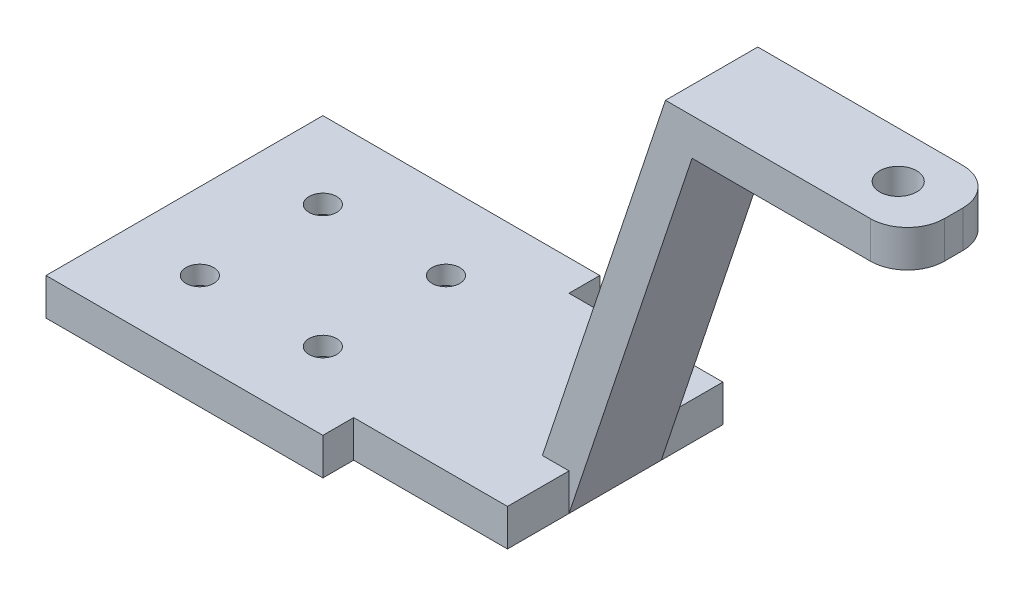
ISO-10303-21;
HEADER;
FILE_DESCRIPTION(('STEP AP214'),'2;1');
FILE_NAME('part.step','',(''),(''),'','','');
FILE_SCHEMA(('AUTOMOTIVE_DESIGN { 1 0 10303 214 1 1 1 1 }'));
ENDSEC;
DATA;
#1=APPLICATION_CONTEXT('core data for automotive mechanical design processes');
#2=APPLICATION_PROTOCOL_DEFINITION('international standard','automotive_design',2000,#1);
#3=PRODUCT_CONTEXT('',#1,'mechanical');
#4=PRODUCT('Part','Part','',(#3));
#5=PRODUCT_RELATED_PRODUCT_CATEGORY('part','',(#4));
#6=PRODUCT_DEFINITION_FORMATION('','',#4);
#7=PRODUCT_DEFINITION_CONTEXT('part definition',#1,'design');
#8=PRODUCT_DEFINITION('design','',#6,#7);
#9=PRODUCT_DEFINITION_SHAPE('','',#8);
#10=(LENGTH_UNIT() NAMED_UNIT(*) SI_UNIT(.MILLI.,.METRE.));
#11=(NAMED_UNIT(*) PLANE_ANGLE_UNIT() SI_UNIT($,.RADIAN.));
#12=(NAMED_UNIT(*) SI_UNIT($,.STERADIAN.) SOLID_ANGLE_UNIT());
#13=UNCERTAINTY_MEASURE_WITH_UNIT(LENGTH_MEASURE(1.E-05),#10,'distance_accuracy_value','');
#14=(GEOMETRIC_REPRESENTATION_CONTEXT(3) GLOBAL_UNCERTAINTY_ASSIGNED_CONTEXT((#13)) GLOBAL_UNIT_ASSIGNED_CONTEXT((#10,
#11,#12)) REPRESENTATION_CONTEXT('',''));
#15=CARTESIAN_POINT('',(0.,0.,0.));
#16=DIRECTION('',(0.,0.,1.));
#17=DIRECTION('',(1.,0.,0.));
#18=AXIS2_PLACEMENT_3D('',#15,#16,#17);
#19=CARTESIAN_POINT('',(0.,0.,0.));
#20=DIRECTION('',(0.,-1.,0.));
#21=DIRECTION('',(0.,0.,-1.));
#22=AXIS2_PLACEMENT_3D('',#19,#20,#21);
#23=PLANE('',#22);
#24=CARTESIAN_POINT('',(-10.,0.,-10.));
#25=DIRECTION('',(0.,-1.,0.));
#26=DIRECTION('',(0.,0.,-1.));
#27=AXIS2_PLACEMENT_3D('',#24,#25,#26);
#28=CIRCLE('',#27,2.25);
#29=CARTESIAN_POINT('',(-10.,0.,-12.25));
#30=VERTEX_POINT('',#29);
#31=EDGE_CURVE('E283',#30,#30,#28,.T.);
#32=ORIENTED_EDGE('',*,*,#31,.T.);
#33=EDGE_LOOP('',(#32));
#34=FACE_BOUND('',#33,.T.);
#35=CARTESIAN_POINT('',(10.,0.,-10.));
#36=DIRECTION('',(0.,-1.,0.));
#37=DIRECTION('',(0.,0.,-1.));
#38=AXIS2_PLACEMENT_3D('',#35,#36,#37);
#39=CIRCLE('',#38,2.25);
#40=CARTESIAN_POINT('',(10.,0.,-12.25));
#41=VERTEX_POINT('',#40);
#42=EDGE_CURVE('E271',#41,#41,#39,.T.);
#43=ORIENTED_EDGE('',*,*,#42,.T.);
#44=EDGE_LOOP('',(#43));
#45=FACE_BOUND('',#44,.T.);
#46=CARTESIAN_POINT('',(10.,0.,10.));
#47=DIRECTION('',(0.,-1.,0.));
#48=DIRECTION('',(0.,0.,-1.));
#49=AXIS2_PLACEMENT_3D('',#46,#47,#48);
#50=CIRCLE('',#49,2.25);
#51=CARTESIAN_POINT('',(10.,0.,7.75));
#52=VERTEX_POINT('',#51);
#53=EDGE_CURVE('E259',#52,#52,#50,.T.);
#54=ORIENTED_EDGE('',*,*,#53,.T.);
#55=EDGE_LOOP('',(#54));
#56=FACE_BOUND('',#55,.T.);
#57=CARTESIAN_POINT('',(-10.,0.,10.));
#58=DIRECTION('',(0.,-1.,0.));
#59=DIRECTION('',(0.,0.,-1.));
#60=AXIS2_PLACEMENT_3D('',#57,#58,#59);
#61=CIRCLE('',#60,2.25);
#62=CARTESIAN_POINT('',(-10.,0.,7.75));
#63=VERTEX_POINT('',#62);
#64=EDGE_CURVE('E247',#63,#63,#61,.T.);
#65=ORIENTED_EDGE('',*,*,#64,.T.);
#66=EDGE_LOOP('',(#65));
#67=FACE_BOUND('',#66,.T.);
#68=DIRECTION('',(1.,0.,0.));
#69=VECTOR('',#68,1.);
#70=CARTESIAN_POINT('',(0.,0.,7.5));
#71=LINE('',#70,#69);
#72=CARTESIAN_POINT('',(43.1754446796632,0.,7.5));
#73=VERTEX_POINT('',#72);
#74=CARTESIAN_POINT('',(47.5,0.,7.5));
#75=VERTEX_POINT('',#74);
#76=EDGE_CURVE('E206',#73,#75,#71,.T.);
#77=ORIENTED_EDGE('',*,*,#76,.F.);
#78=DIRECTION('',(0.,0.,1.));
#79=VECTOR('',#78,1.);
#80=CARTESIAN_POINT('',(43.1754446796632,0.,0.));
#81=LINE('',#80,#79);
#82=CARTESIAN_POINT('',(43.1754446796632,0.,-7.5));
#83=VERTEX_POINT('',#82);
#84=EDGE_CURVE('E324',#83,#73,#81,.T.);
#85=ORIENTED_EDGE('',*,*,#84,.F.);
#86=DIRECTION('',(1.,0.,0.));
#87=VECTOR('',#86,1.);
#88=CARTESIAN_POINT('',(0.,0.,-7.5));
#89=LINE('',#88,#87);
#90=CARTESIAN_POINT('',(47.5,0.,-7.5));
#91=VERTEX_POINT('',#90);
#92=EDGE_CURVE('E203',#83,#91,#89,.T.);
#93=ORIENTED_EDGE('',*,*,#92,.T.);
#94=DIRECTION('',(0.,0.,1.));
#95=VECTOR('',#94,1.);
#96=CARTESIAN_POINT('',(47.5,0.,17.5));
#97=LINE('',#96,#95);
#98=CARTESIAN_POINT('',(47.5,0.,-17.5));
#99=VERTEX_POINT('',#98);
#100=EDGE_CURVE('E220',#99,#91,#97,.T.);
#101=ORIENTED_EDGE('',*,*,#100,.F.);
#102=DIRECTION('',(-1.,0.,0.));
#103=VECTOR('',#102,1.);
#104=CARTESIAN_POINT('',(47.5,0.,-17.5));
#105=LINE('',#104,#103);
#106=CARTESIAN_POINT('',(22.5,0.,-17.5));
#107=VERTEX_POINT('',#106);
#108=EDGE_CURVE('E229',#99,#107,#105,.T.);
#109=ORIENTED_EDGE('',*,*,#108,.T.);
#110=DIRECTION('',(0.,0.,-1.));
#111=VECTOR('',#110,1.);
#112=CARTESIAN_POINT('',(22.5,0.,22.5));
#113=LINE('',#112,#111);
#114=CARTESIAN_POINT('',(22.5,0.,-22.5));
#115=VERTEX_POINT('',#114);
#116=EDGE_CURVE('E286',#107,#115,#113,.T.);
#117=ORIENTED_EDGE('',*,*,#116,.T.);
#118=DIRECTION('',(-1.,0.,0.));
#119=VECTOR('',#118,1.);
#120=CARTESIAN_POINT('',(-22.5,0.,-22.5));
#121=LINE('',#120,#119);
#122=CARTESIAN_POINT('',(-22.5,0.,-22.5));
#123=VERTEX_POINT('',#122);
#124=EDGE_CURVE('E303',#115,#123,#121,.T.);
#125=ORIENTED_EDGE('',*,*,#124,.T.);
#126=DIRECTION('',(0.,0.,1.));
#127=VECTOR('',#126,1.);
#128=CARTESIAN_POINT('',(-22.5,0.,22.5));
#129=LINE('',#128,#127);
#130=CARTESIAN_POINT('',(-22.5,0.,22.5));
#131=VERTEX_POINT('',#130);
#132=EDGE_CURVE('E306',#123,#131,#129,.T.);
#133=ORIENTED_EDGE('',*,*,#132,.T.);
#134=DIRECTION('',(1.,0.,0.));
#135=VECTOR('',#134,1.);
#136=CARTESIAN_POINT('',(-22.5,0.,22.5));
#137=LINE('',#136,#135);
#138=CARTESIAN_POINT('',(22.5,0.,22.5));
#139=VERTEX_POINT('',#138);
#140=EDGE_CURVE('E309',#131,#139,#137,.T.);
#141=ORIENTED_EDGE('',*,*,#140,.T.);
#142=CARTESIAN_POINT('',(22.5,0.,17.5));
#143=VERTEX_POINT('',#142);
#144=EDGE_CURVE('E300',#139,#143,#113,.T.);
#145=ORIENTED_EDGE('',*,*,#144,.T.);
#146=DIRECTION('',(-1.,0.,0.));
#147=VECTOR('',#146,1.);
#148=CARTESIAN_POINT('',(47.5,0.,17.5));
#149=LINE('',#148,#147);
#150=CARTESIAN_POINT('',(47.5,0.,17.5));
#151=VERTEX_POINT('',#150);
#152=EDGE_CURVE('E222',#151,#143,#149,.T.);
#153=ORIENTED_EDGE('',*,*,#152,.F.);
#154=EDGE_CURVE('E219',#75,#151,#97,.T.);
#155=ORIENTED_EDGE('',*,*,#154,.F.);
#156=EDGE_LOOP('',(#77,#85,#93,#101,#109,#117,#125,#133,#141,#145,#153,#155));
#157=FACE_BOUND('',#156,.T.);
#158=ADVANCED_FACE('F35',(#34,#45,#56,#67,#157),#23,.F.);
#159=CARTESIAN_POINT('',(47.5,0.,0.));
#160=DIRECTION('',(1.,0.,0.));
#161=DIRECTION('',(0.,0.,-1.));
#162=AXIS2_PLACEMENT_3D('',#159,#160,#161);
#163=PLANE('',#162);
#164=DIRECTION('',(0.,0.,-1.));
#165=VECTOR('',#164,1.);
#166=CARTESIAN_POINT('',(47.5,-6.,17.5));
#167=LINE('',#166,#165);
#168=CARTESIAN_POINT('',(47.5,-6.,17.5));
#169=VERTEX_POINT('',#168);
#170=CARTESIAN_POINT('',(47.5,-6.,7.5));
#171=VERTEX_POINT('',#170);
#172=EDGE_CURVE('E214',#169,#171,#167,.T.);
#173=ORIENTED_EDGE('',*,*,#172,.T.);
#174=DIRECTION('',(0.,1.,0.));
#175=VECTOR('',#174,1.);
#176=CARTESIAN_POINT('',(47.5,0.,7.5));
#177=LINE('',#176,#175);
#178=EDGE_CURVE('E164',#171,#75,#177,.T.);
#179=ORIENTED_EDGE('',*,*,#178,.T.);
#180=ORIENTED_EDGE('',*,*,#154,.T.);
#181=DIRECTION('',(0.,-1.,0.));
#182=VECTOR('',#181,1.);
#183=CARTESIAN_POINT('',(47.5,0.,17.5));
#184=LINE('',#183,#182);
#185=EDGE_CURVE('E209',#151,#169,#184,.T.);
#186=ORIENTED_EDGE('',*,*,#185,.T.);
#187=EDGE_LOOP('',(#173,#179,#180,#186));
#188=FACE_BOUND('',#187,.T.);
#189=ADVANCED_FACE('F362',(#188),#163,.T.);
#190=CARTESIAN_POINT('',(22.5,-6.,22.5));
#191=DIRECTION('',(1.,0.,0.));
#192=DIRECTION('',(0.,0.,-1.));
#193=AXIS2_PLACEMENT_3D('',#190,#191,#192);
#194=PLANE('',#193);
#195=DIRECTION('',(0.,-1.,0.));
#196=VECTOR('',#195,1.);
#197=CARTESIAN_POINT('',(22.5,0.,17.5));
#198=LINE('',#197,#196);
#199=CARTESIAN_POINT('',(22.5,-6.,17.5));
#200=VERTEX_POINT('',#199);
#201=EDGE_CURVE('E208',#143,#200,#198,.T.);
#202=ORIENTED_EDGE('',*,*,#201,.F.);
#203=ORIENTED_EDGE('',*,*,#144,.F.);
#204=DIRECTION('',(0.,1.,0.));
#205=VECTOR('',#204,1.);
#206=CARTESIAN_POINT('',(22.5,-6.,22.5));
#207=LINE('',#206,#205);
#208=CARTESIAN_POINT('',(22.5,-6.,22.5));
#209=VERTEX_POINT('',#208);
#210=EDGE_CURVE('E312',#209,#139,#207,.T.);
#211=ORIENTED_EDGE('',*,*,#210,.F.);
#212=DIRECTION('',(0.,0.,-1.));
#213=VECTOR('',#212,1.);
#214=CARTESIAN_POINT('',(22.5,-6.,22.5));
#215=LINE('',#214,#213);
#216=EDGE_CURVE('E287',#209,#200,#215,.T.);
#217=ORIENTED_EDGE('',*,*,#216,.T.);
#218=EDGE_LOOP('',(#202,#203,#211,#217));
#219=FACE_BOUND('',#218,.T.);
#220=ADVANCED_FACE('F368',(#219),#194,.T.);
#221=DIRECTION('',(0.,1.,0.));
#222=VECTOR('',#221,1.);
#223=CARTESIAN_POINT('',(22.5,0.,-17.5));
#224=LINE('',#223,#222);
#225=CARTESIAN_POINT('',(22.5,-6.,-17.5));
#226=VERTEX_POINT('',#225);
#227=EDGE_CURVE('E213',#226,#107,#224,.T.);
#228=ORIENTED_EDGE('',*,*,#227,.F.);
#229=CARTESIAN_POINT('',(22.5,-6.,-22.5));
#230=VERTEX_POINT('',#229);
#231=EDGE_CURVE('E290',#226,#230,#215,.T.);
#232=ORIENTED_EDGE('',*,*,#231,.T.);
#233=DIRECTION('',(0.,1.,0.));
#234=VECTOR('',#233,1.);
#235=CARTESIAN_POINT('',(22.5,-6.,-22.5));
#236=LINE('',#235,#234);
#237=EDGE_CURVE('E299',#230,#115,#236,.T.);
#238=ORIENTED_EDGE('',*,*,#237,.T.);
#239=ORIENTED_EDGE('',*,*,#116,.F.);
#240=EDGE_LOOP('',(#228,#232,#238,#239));
#241=FACE_BOUND('',#240,.T.);
#242=ADVANCED_FACE('F381',(#241),#194,.T.);
#243=CARTESIAN_POINT('',(-22.5,-6.,22.5));
#244=DIRECTION('',(0.,0.,1.));
#245=DIRECTION('',(1.,0.,0.));
#246=AXIS2_PLACEMENT_3D('',#243,#244,#245);
#247=PLANE('',#246);
#248=ORIENTED_EDGE('',*,*,#140,.F.);
#249=DIRECTION('',(0.,1.,0.));
#250=VECTOR('',#249,1.);
#251=CARTESIAN_POINT('',(-22.5,-6.,22.5));
#252=LINE('',#251,#250);
#253=CARTESIAN_POINT('',(-22.5,-6.,22.5));
#254=VERTEX_POINT('',#253);
#255=EDGE_CURVE('E315',#254,#131,#252,.T.);
#256=ORIENTED_EDGE('',*,*,#255,.F.);
#257=DIRECTION('',(1.,0.,0.));
#258=VECTOR('',#257,1.);
#259=CARTESIAN_POINT('',(-22.5,-6.,22.5));
#260=LINE('',#259,#258);
#261=EDGE_CURVE('E296',#254,#209,#260,.T.);
#262=ORIENTED_EDGE('',*,*,#261,.T.);
#263=ORIENTED_EDGE('',*,*,#210,.T.);
#264=EDGE_LOOP('',(#248,#256,#262,#263));
#265=FACE_BOUND('',#264,.T.);
#266=ADVANCED_FACE('F377',(#265),#247,.T.);
#267=CARTESIAN_POINT('',(-22.5,-6.,22.5));
#268=DIRECTION('',(-1.,0.,0.));
#269=DIRECTION('',(0.,0.,1.));
#270=AXIS2_PLACEMENT_3D('',#267,#268,#269);
#271=PLANE('',#270);
#272=ORIENTED_EDGE('',*,*,#132,.F.);
#273=DIRECTION('',(0.,1.,0.));
#274=VECTOR('',#273,1.);
#275=CARTESIAN_POINT('',(-22.5,-6.,-22.5));
#276=LINE('',#275,#274);
#277=CARTESIAN_POINT('',(-22.5,-6.,-22.5));
#278=VERTEX_POINT('',#277);
#279=EDGE_CURVE('E317',#278,#123,#276,.T.);
#280=ORIENTED_EDGE('',*,*,#279,.F.);
#281=DIRECTION('',(0.,0.,1.));
#282=VECTOR('',#281,1.);
#283=CARTESIAN_POINT('',(-22.5,-6.,22.5));
#284=LINE('',#283,#282);
#285=EDGE_CURVE('E293',#278,#254,#284,.T.);
#286=ORIENTED_EDGE('',*,*,#285,.T.);
#287=ORIENTED_EDGE('',*,*,#255,.T.);
#288=EDGE_LOOP('',(#272,#280,#286,#287));
#289=FACE_BOUND('',#288,.T.);
#290=ADVANCED_FACE('F380',(#289),#271,.T.);
#291=CARTESIAN_POINT('',(-22.5,-6.,-22.5));
#292=DIRECTION('',(0.,0.,-1.));
#293=DIRECTION('',(-1.,0.,0.));
#294=AXIS2_PLACEMENT_3D('',#291,#292,#293);
#295=PLANE('',#294);
#296=ORIENTED_EDGE('',*,*,#124,.F.);
#297=ORIENTED_EDGE('',*,*,#237,.F.);
#298=DIRECTION('',(-1.,0.,0.));
#299=VECTOR('',#298,1.);
#300=CARTESIAN_POINT('',(-22.5,-6.,-22.5));
#301=LINE('',#300,#299);
#302=EDGE_CURVE('E289',#230,#278,#301,.T.);
#303=ORIENTED_EDGE('',*,*,#302,.T.);
#304=ORIENTED_EDGE('',*,*,#279,.T.);
#305=EDGE_LOOP('',(#296,#297,#303,#304));
#306=FACE_BOUND('',#305,.T.);
#307=ADVANCED_FACE('F385',(#306),#295,.T.);
#308=CARTESIAN_POINT('',(0.,-6.,0.));
#309=DIRECTION('',(0.,-1.,0.));
#310=DIRECTION('',(0.,0.,-1.));
#311=AXIS2_PLACEMENT_3D('',#308,#309,#310);
#312=PLANE('',#311);
#313=DIRECTION('',(0.,0.,-1.));
#314=VECTOR('',#313,1.);
#315=CARTESIAN_POINT('',(47.5,-6.,7.5));
#316=LINE('',#315,#314);
#317=CARTESIAN_POINT('',(47.5,-6.,-7.5));
#318=VERTEX_POINT('',#317);
#319=EDGE_CURVE('E174',#171,#318,#316,.T.);
#320=ORIENTED_EDGE('',*,*,#319,.F.);
#321=ORIENTED_EDGE('',*,*,#172,.F.);
#322=DIRECTION('',(-1.,0.,0.));
#323=VECTOR('',#322,1.);
#324=CARTESIAN_POINT('',(47.5,-6.,17.5));
#325=LINE('',#324,#323);
#326=EDGE_CURVE('E235',#169,#200,#325,.T.);
#327=ORIENTED_EDGE('',*,*,#326,.T.);
#328=ORIENTED_EDGE('',*,*,#216,.F.);
#329=ORIENTED_EDGE('',*,*,#261,.F.);
#330=ORIENTED_EDGE('',*,*,#285,.F.);
#331=ORIENTED_EDGE('',*,*,#302,.F.);
#332=ORIENTED_EDGE('',*,*,#231,.F.);
#333=DIRECTION('',(-1.,0.,0.));
#334=VECTOR('',#333,1.);
#335=CARTESIAN_POINT('',(47.5,-6.,-17.5));
#336=LINE('',#335,#334);
#337=CARTESIAN_POINT('',(47.5,-6.,-17.5));
#338=VERTEX_POINT('',#337);
#339=EDGE_CURVE('E232',#338,#226,#336,.T.);
#340=ORIENTED_EDGE('',*,*,#339,.F.);
#341=EDGE_CURVE('E212',#318,#338,#167,.T.);
#342=ORIENTED_EDGE('',*,*,#341,.F.);
#343=EDGE_LOOP('',(#320,#321,#327,#328,#329,#330,#331,#332,#340,#342));
#344=FACE_BOUND('',#343,.T.);
#345=CARTESIAN_POINT('',(-10.,-6.,10.));
#346=DIRECTION('',(0.,-1.,0.));
#347=DIRECTION('',(0.,0.,-1.));
#348=AXIS2_PLACEMENT_3D('',#345,#346,#347);
#349=CIRCLE('',#348,5.295);
#350=CARTESIAN_POINT('',(-10.,-6.,4.705));
#351=VERTEX_POINT('',#350);
#352=EDGE_CURVE('E238',#351,#351,#349,.T.);
#353=ORIENTED_EDGE('',*,*,#352,.F.);
#354=EDGE_LOOP('',(#353));
#355=FACE_BOUND('',#354,.T.);
#356=CARTESIAN_POINT('',(10.,-6.,10.));
#357=DIRECTION('',(0.,-1.,0.));
#358=DIRECTION('',(0.,0.,-1.));
#359=AXIS2_PLACEMENT_3D('',#356,#357,#358);
#360=CIRCLE('',#359,5.295);
#361=CARTESIAN_POINT('',(10.,-6.,4.705));
#362=VERTEX_POINT('',#361);
#363=EDGE_CURVE('E250',#362,#362,#360,.T.);
#364=ORIENTED_EDGE('',*,*,#363,.F.);
#365=EDGE_LOOP('',(#364));
#366=FACE_BOUND('',#365,.T.);
#367=CARTESIAN_POINT('',(10.,-6.,-10.));
#368=DIRECTION('',(0.,-1.,0.));
#369=DIRECTION('',(0.,0.,-1.));
#370=AXIS2_PLACEMENT_3D('',#367,#368,#369);
#371=CIRCLE('',#370,5.295);
#372=CARTESIAN_POINT('',(10.,-6.,-15.295));
#373=VERTEX_POINT('',#372);
#374=EDGE_CURVE('E262',#373,#373,#371,.T.);
#375=ORIENTED_EDGE('',*,*,#374,.F.);
#376=EDGE_LOOP('',(#375));
#377=FACE_BOUND('',#376,.T.);
#378=CARTESIAN_POINT('',(-10.,-6.,-10.));
#379=DIRECTION('',(0.,-1.,0.));
#380=DIRECTION('',(0.,0.,-1.));
#381=AXIS2_PLACEMENT_3D('',#378,#379,#380);
#382=CIRCLE('',#381,5.295);
#383=CARTESIAN_POINT('',(-10.,-6.,-15.295));
#384=VERTEX_POINT('',#383);
#385=EDGE_CURVE('E274',#384,#384,#382,.T.);
#386=ORIENTED_EDGE('',*,*,#385,.F.);
#387=EDGE_LOOP('',(#386));
#388=FACE_BOUND('',#387,.T.);
#389=ADVANCED_FACE('F375',(#344,#355,#366,#377,#388),#312,.T.);
#390=CARTESIAN_POINT('',(-10.,-6.,-10.));
#391=DIRECTION('',(0.,-1.,0.));
#392=DIRECTION('',(0.,0.,-1.));
#393=AXIS2_PLACEMENT_3D('',#390,#391,#392);
#394=CYLINDRICAL_SURFACE('',#393,2.25);
#395=ORIENTED_EDGE('',*,*,#31,.F.);
#396=EDGE_LOOP('',(#395));
#397=FACE_BOUND('',#396,.T.);
#398=CARTESIAN_POINT('',(-10.,-3.,-10.));
#399=DIRECTION('',(0.,-1.,0.));
#400=DIRECTION('',(0.,0.,-1.));
#401=AXIS2_PLACEMENT_3D('',#398,#399,#400);
#402=CIRCLE('',#401,2.25);
#403=CARTESIAN_POINT('',(-10.,-3.,-12.25));
#404=VERTEX_POINT('',#403);
#405=EDGE_CURVE('E280',#404,#404,#402,.T.);
#406=ORIENTED_EDGE('',*,*,#405,.T.);
#407=EDGE_LOOP('',(#406));
#408=FACE_BOUND('',#407,.T.);
#409=ADVANCED_FACE('F472',(#397,#408),#394,.F.);
#410=CARTESIAN_POINT('',(-7.75,-3.,-10.));
#411=DIRECTION('',(0.,1.,0.));
#412=DIRECTION('',(0.,0.,1.));
#413=AXIS2_PLACEMENT_3D('',#410,#411,#412);
#414=PLANE('',#413);
#415=ORIENTED_EDGE('',*,*,#405,.F.);
#416=EDGE_LOOP('',(#415));
#417=FACE_BOUND('',#416,.T.);
#418=CARTESIAN_POINT('',(-10.,-3.,-10.));
#419=DIRECTION('',(0.,-1.,0.));
#420=DIRECTION('',(0.,0.,-1.));
#421=AXIS2_PLACEMENT_3D('',#418,#419,#420);
#422=CIRCLE('',#421,5.295);
#423=CARTESIAN_POINT('',(-10.,-3.,-15.295));
#424=VERTEX_POINT('',#423);
#425=EDGE_CURVE('E277',#424,#424,#422,.T.);
#426=ORIENTED_EDGE('',*,*,#425,.T.);
#427=EDGE_LOOP('',(#426));
#428=FACE_BOUND('',#427,.T.);
#429=ADVANCED_FACE('F469',(#417,#428),#414,.F.);
#430=CARTESIAN_POINT('',(-10.,-6.,-10.));
#431=DIRECTION('',(0.,-1.,0.));
#432=DIRECTION('',(0.,0.,-1.));
#433=AXIS2_PLACEMENT_3D('',#430,#431,#432);
#434=CYLINDRICAL_SURFACE('',#433,5.295);
#435=ORIENTED_EDGE('',*,*,#425,.F.);
#436=EDGE_LOOP('',(#435));
#437=FACE_BOUND('',#436,.T.);
#438=ORIENTED_EDGE('',*,*,#385,.T.);
#439=EDGE_LOOP('',(#438));
#440=FACE_BOUND('',#439,.T.);
#441=ADVANCED_FACE('F465',(#437,#440),#434,.F.);
#442=CARTESIAN_POINT('',(10.,-6.,-10.));
#443=DIRECTION('',(0.,-1.,0.));
#444=DIRECTION('',(0.,0.,-1.));
#445=AXIS2_PLACEMENT_3D('',#442,#443,#444);
#446=CYLINDRICAL_SURFACE('',#445,2.25);
#447=ORIENTED_EDGE('',*,*,#42,.F.);
#448=EDGE_LOOP('',(#447));
#449=FACE_BOUND('',#448,.T.);
#450=CARTESIAN_POINT('',(10.,-3.,-10.));
#451=DIRECTION('',(0.,-1.,0.));
#452=DIRECTION('',(0.,0.,-1.));
#453=AXIS2_PLACEMENT_3D('',#450,#451,#452);
#454=CIRCLE('',#453,2.25);
#455=CARTESIAN_POINT('',(10.,-3.,-12.25));
#456=VERTEX_POINT('',#455);
#457=EDGE_CURVE('E268',#456,#456,#454,.T.);
#458=ORIENTED_EDGE('',*,*,#457,.T.);
#459=EDGE_LOOP('',(#458));
#460=FACE_BOUND('',#459,.T.);
#461=ADVANCED_FACE('F461',(#449,#460),#446,.F.);
#462=CARTESIAN_POINT('',(12.25,-3.,-10.));
#463=DIRECTION('',(0.,1.,0.));
#464=DIRECTION('',(0.,0.,1.));
#465=AXIS2_PLACEMENT_3D('',#462,#463,#464);
#466=PLANE('',#465);
#467=ORIENTED_EDGE('',*,*,#457,.F.);
#468=EDGE_LOOP('',(#467));
#469=FACE_BOUND('',#468,.T.);
#470=CARTESIAN_POINT('',(10.,-3.,-10.));
#471=DIRECTION('',(0.,-1.,0.));
#472=DIRECTION('',(0.,0.,-1.));
#473=AXIS2_PLACEMENT_3D('',#470,#471,#472);
#474=CIRCLE('',#473,5.295);
#475=CARTESIAN_POINT('',(10.,-3.,-15.295));
#476=VERTEX_POINT('',#475);
#477=EDGE_CURVE('E265',#476,#476,#474,.T.);
#478=ORIENTED_EDGE('',*,*,#477,.T.);
#479=EDGE_LOOP('',(#478));
#480=FACE_BOUND('',#479,.T.);
#481=ADVANCED_FACE('F457',(#469,#480),#466,.F.);
#482=CARTESIAN_POINT('',(10.,-6.,-10.));
#483=DIRECTION('',(0.,-1.,0.));
#484=DIRECTION('',(0.,0.,-1.));
#485=AXIS2_PLACEMENT_3D('',#482,#483,#484);
#486=CYLINDRICAL_SURFACE('',#485,5.295);
#487=ORIENTED_EDGE('',*,*,#477,.F.);
#488=EDGE_LOOP('',(#487));
#489=FACE_BOUND('',#488,.T.);
#490=ORIENTED_EDGE('',*,*,#374,.T.);
#491=EDGE_LOOP('',(#490));
#492=FACE_BOUND('',#491,.T.);
#493=ADVANCED_FACE('F453',(#489,#492),#486,.F.);
#494=CARTESIAN_POINT('',(10.,-6.,10.));
#495=DIRECTION('',(0.,-1.,0.));
#496=DIRECTION('',(0.,0.,-1.));
#497=AXIS2_PLACEMENT_3D('',#494,#495,#496);
#498=CYLINDRICAL_SURFACE('',#497,2.25);
#499=ORIENTED_EDGE('',*,*,#53,.F.);
#500=EDGE_LOOP('',(#499));
#501=FACE_BOUND('',#500,.T.);
#502=CARTESIAN_POINT('',(10.,-3.,10.));
#503=DIRECTION('',(0.,-1.,0.));
#504=DIRECTION('',(0.,0.,-1.));
#505=AXIS2_PLACEMENT_3D('',#502,#503,#504);
#506=CIRCLE('',#505,2.25);
#507=CARTESIAN_POINT('',(10.,-3.,7.75));
#508=VERTEX_POINT('',#507);
#509=EDGE_CURVE('E256',#508,#508,#506,.T.);
#510=ORIENTED_EDGE('',*,*,#509,.T.);
#511=EDGE_LOOP('',(#510));
#512=FACE_BOUND('',#511,.T.);
#513=ADVANCED_FACE('F449',(#501,#512),#498,.F.);
#514=CARTESIAN_POINT('',(12.25,-3.,10.));
#515=DIRECTION('',(0.,1.,0.));
#516=DIRECTION('',(0.,0.,1.));
#517=AXIS2_PLACEMENT_3D('',#514,#515,#516);
#518=PLANE('',#517);
#519=ORIENTED_EDGE('',*,*,#509,.F.);
#520=EDGE_LOOP('',(#519));
#521=FACE_BOUND('',#520,.T.);
#522=CARTESIAN_POINT('',(10.,-3.,10.));
#523=DIRECTION('',(0.,-1.,0.));
#524=DIRECTION('',(0.,0.,-1.));
#525=AXIS2_PLACEMENT_3D('',#522,#523,#524);
#526=CIRCLE('',#525,5.295);
#527=CARTESIAN_POINT('',(10.,-3.,4.705));
#528=VERTEX_POINT('',#527);
#529=EDGE_CURVE('E253',#528,#528,#526,.T.);
#530=ORIENTED_EDGE('',*,*,#529,.T.);
#531=EDGE_LOOP('',(#530));
#532=FACE_BOUND('',#531,.T.);
#533=ADVANCED_FACE('F445',(#521,#532),#518,.F.);
#534=CARTESIAN_POINT('',(10.,-6.,10.));
#535=DIRECTION('',(0.,-1.,0.));
#536=DIRECTION('',(0.,0.,-1.));
#537=AXIS2_PLACEMENT_3D('',#534,#535,#536);
#538=CYLINDRICAL_SURFACE('',#537,5.295);
#539=ORIENTED_EDGE('',*,*,#529,.F.);
#540=EDGE_LOOP('',(#539));
#541=FACE_BOUND('',#540,.T.);
#542=ORIENTED_EDGE('',*,*,#363,.T.);
#543=EDGE_LOOP('',(#542));
#544=FACE_BOUND('',#543,.T.);
#545=ADVANCED_FACE('F441',(#541,#544),#538,.F.);
#546=CARTESIAN_POINT('',(-10.,-6.,10.));
#547=DIRECTION('',(0.,-1.,0.));
#548=DIRECTION('',(0.,0.,-1.));
#549=AXIS2_PLACEMENT_3D('',#546,#547,#548);
#550=CYLINDRICAL_SURFACE('',#549,2.25);
#551=ORIENTED_EDGE('',*,*,#64,.F.);
#552=EDGE_LOOP('',(#551));
#553=FACE_BOUND('',#552,.T.);
#554=CARTESIAN_POINT('',(-10.,-3.,10.));
#555=DIRECTION('',(0.,-1.,0.));
#556=DIRECTION('',(0.,0.,-1.));
#557=AXIS2_PLACEMENT_3D('',#554,#555,#556);
#558=CIRCLE('',#557,2.25);
#559=CARTESIAN_POINT('',(-10.,-3.,7.75));
#560=VERTEX_POINT('',#559);
#561=EDGE_CURVE('E244',#560,#560,#558,.T.);
#562=ORIENTED_EDGE('',*,*,#561,.T.);
#563=EDGE_LOOP('',(#562));
#564=FACE_BOUND('',#563,.T.);
#565=ADVANCED_FACE('F437',(#553,#564),#550,.F.);
#566=CARTESIAN_POINT('',(-7.75,-3.,10.));
#567=DIRECTION('',(0.,1.,0.));
#568=DIRECTION('',(0.,0.,1.));
#569=AXIS2_PLACEMENT_3D('',#566,#567,#568);
#570=PLANE('',#569);
#571=ORIENTED_EDGE('',*,*,#561,.F.);
#572=EDGE_LOOP('',(#571));
#573=FACE_BOUND('',#572,.T.);
#574=CARTESIAN_POINT('',(-10.,-3.,10.));
#575=DIRECTION('',(0.,-1.,0.));
#576=DIRECTION('',(0.,0.,-1.));
#577=AXIS2_PLACEMENT_3D('',#574,#575,#576);
#578=CIRCLE('',#577,5.295);
#579=CARTESIAN_POINT('',(-10.,-3.,4.705));
#580=VERTEX_POINT('',#579);
#581=EDGE_CURVE('E241',#580,#580,#578,.T.);
#582=ORIENTED_EDGE('',*,*,#581,.T.);
#583=EDGE_LOOP('',(#582));
#584=FACE_BOUND('',#583,.T.);
#585=ADVANCED_FACE('F431',(#573,#584),#570,.F.);
#586=CARTESIAN_POINT('',(-10.,-6.,10.));
#587=DIRECTION('',(0.,-1.,0.));
#588=DIRECTION('',(0.,0.,-1.));
#589=AXIS2_PLACEMENT_3D('',#586,#587,#588);
#590=CYLINDRICAL_SURFACE('',#589,5.295);
#591=ORIENTED_EDGE('',*,*,#581,.F.);
#592=EDGE_LOOP('',(#591));
#593=FACE_BOUND('',#592,.T.);
#594=ORIENTED_EDGE('',*,*,#352,.T.);
#595=EDGE_LOOP('',(#594));
#596=FACE_BOUND('',#595,.T.);
#597=ADVANCED_FACE('F424',(#593,#596),#590,.F.);
#598=CARTESIAN_POINT('',(47.5,0.,17.5));
#599=DIRECTION('',(0.,0.,-1.));
#600=DIRECTION('',(-1.,0.,0.));
#601=AXIS2_PLACEMENT_3D('',#598,#599,#600);
#602=PLANE('',#601);
#603=ORIENTED_EDGE('',*,*,#201,.T.);
#604=ORIENTED_EDGE('',*,*,#326,.F.);
#605=ORIENTED_EDGE('',*,*,#185,.F.);
#606=ORIENTED_EDGE('',*,*,#152,.T.);
#607=EDGE_LOOP('',(#603,#604,#605,#606));
#608=FACE_BOUND('',#607,.T.);
#609=ADVANCED_FACE('F415',(#608),#602,.F.);
#610=CARTESIAN_POINT('',(47.5,0.,-17.5));
#611=DIRECTION('',(0.,0.,1.));
#612=DIRECTION('',(1.,0.,0.));
#613=AXIS2_PLACEMENT_3D('',#610,#611,#612);
#614=PLANE('',#613);
#615=ORIENTED_EDGE('',*,*,#227,.T.);
#616=ORIENTED_EDGE('',*,*,#108,.F.);
#617=DIRECTION('',(0.,1.,0.));
#618=VECTOR('',#617,1.);
#619=CARTESIAN_POINT('',(47.5,0.,-17.5));
#620=LINE('',#619,#618);
#621=EDGE_CURVE('E217',#338,#99,#620,.T.);
#622=ORIENTED_EDGE('',*,*,#621,.F.);
#623=ORIENTED_EDGE('',*,*,#339,.T.);
#624=EDGE_LOOP('',(#615,#616,#622,#623));
#625=FACE_BOUND('',#624,.T.);
#626=ADVANCED_FACE('F407',(#625),#614,.F.);
#627=DIRECTION('',(0.,1.,0.));
#628=VECTOR('',#627,1.);
#629=CARTESIAN_POINT('',(47.5,0.,-7.5));
#630=LINE('',#629,#628);
#631=EDGE_CURVE('E314',#318,#91,#630,.T.);
#632=ORIENTED_EDGE('',*,*,#631,.F.);
#633=ORIENTED_EDGE('',*,*,#341,.T.);
#634=ORIENTED_EDGE('',*,*,#621,.T.);
#635=ORIENTED_EDGE('',*,*,#100,.T.);
#636=EDGE_LOOP('',(#632,#633,#634,#635));
#637=FACE_BOUND('',#636,.T.);
#638=ADVANCED_FACE('F371',(#637),#163,.T.);
#639=CARTESIAN_POINT('',(63.1754446796632,60.,7.5));
#640=DIRECTION('',(0.948683298050514,-0.316227766016838,0.));
#641=DIRECTION('',(0.316227766016838,0.948683298050514,0.));
#642=AXIS2_PLACEMENT_3D('',#639,#640,#641);
#643=PLANE('',#642);
#644=DIRECTION('',(-0.316227766016838,-0.948683298050514,0.));
#645=VECTOR('',#644,1.);
#646=CARTESIAN_POINT('',(63.1754446796632,60.,-7.5));
#647=LINE('',#646,#645);
#648=CARTESIAN_POINT('',(63.1754446796632,60.,-7.5));
#649=VERTEX_POINT('',#648);
#650=EDGE_CURVE('E167',#649,#83,#647,.T.);
#651=ORIENTED_EDGE('',*,*,#650,.T.);
#652=ORIENTED_EDGE('',*,*,#84,.T.);
#653=DIRECTION('',(-0.316227766016838,-0.948683298050514,0.));
#654=VECTOR('',#653,1.);
#655=CARTESIAN_POINT('',(63.1754446796632,60.,7.5));
#656=LINE('',#655,#654);
#657=CARTESIAN_POINT('',(63.1754446796632,60.,7.5));
#658=VERTEX_POINT('',#657);
#659=EDGE_CURVE('E180',#658,#73,#656,.T.);
#660=ORIENTED_EDGE('',*,*,#659,.F.);
#661=DIRECTION('',(0.,0.,-1.));
#662=VECTOR('',#661,1.);
#663=CARTESIAN_POINT('',(63.1754446796632,60.,7.5));
#664=LINE('',#663,#662);
#665=EDGE_CURVE('E186',#658,#649,#664,.T.);
#666=ORIENTED_EDGE('',*,*,#665,.T.);
#667=EDGE_LOOP('',(#651,#652,#660,#666));
#668=FACE_BOUND('',#667,.T.);
#669=ADVANCED_FACE('F352',(#668),#643,.F.);
#670=CARTESIAN_POINT('',(0.,0.,7.5));
#671=DIRECTION('',(0.,0.,-1.));
#672=DIRECTION('',(-1.,0.,0.));
#673=AXIS2_PLACEMENT_3D('',#670,#671,#672);
#674=PLANE('',#673);
#675=DIRECTION('',(1.,0.,0.));
#676=VECTOR('',#675,1.);
#677=CARTESIAN_POINT('',(67.5,54.,7.5));
#678=LINE('',#677,#676);
#679=CARTESIAN_POINT('',(67.5,54.,7.5));
#680=VERTEX_POINT('',#679);
#681=CARTESIAN_POINT('',(96.5,54.,7.5));
#682=VERTEX_POINT('',#681);
#683=EDGE_CURVE('E161',#680,#682,#678,.T.);
#684=ORIENTED_EDGE('',*,*,#683,.T.);
#685=DIRECTION('',(0.,1.,0.));
#686=VECTOR('',#685,1.);
#687=CARTESIAN_POINT('',(96.5,0.,7.5));
#688=LINE('',#687,#686);
#689=CARTESIAN_POINT('',(96.5,60.,7.5));
#690=VERTEX_POINT('',#689);
#691=EDGE_CURVE('E11',#682,#690,#688,.T.);
#692=ORIENTED_EDGE('',*,*,#691,.T.);
#693=DIRECTION('',(-1.,0.,0.));
#694=VECTOR('',#693,1.);
#695=CARTESIAN_POINT('',(102.5,60.,7.5));
#696=LINE('',#695,#694);
#697=EDGE_CURVE('E178',#690,#658,#696,.T.);
#698=ORIENTED_EDGE('',*,*,#697,.T.);
#699=ORIENTED_EDGE('',*,*,#659,.T.);
#700=ORIENTED_EDGE('',*,*,#76,.T.);
#701=ORIENTED_EDGE('',*,*,#178,.F.);
#702=DIRECTION('',(0.316227766016838,0.948683298050514,0.));
#703=VECTOR('',#702,1.);
#704=CARTESIAN_POINT('',(47.5,-6.,7.5));
#705=LINE('',#704,#703);
#706=EDGE_CURVE('E158',#171,#680,#705,.T.);
#707=ORIENTED_EDGE('',*,*,#706,.T.);
#708=EDGE_LOOP('',(#684,#692,#698,#699,#700,#701,#707));
#709=FACE_BOUND('',#708,.T.);
#710=ADVANCED_FACE('F160',(#709),#674,.F.);
#711=CARTESIAN_POINT('',(0.,0.,-7.5));
#712=DIRECTION('',(0.,0.,-1.));
#713=DIRECTION('',(-1.,0.,0.));
#714=AXIS2_PLACEMENT_3D('',#711,#712,#713);
#715=PLANE('',#714);
#716=DIRECTION('',(-1.,0.,0.));
#717=VECTOR('',#716,1.);
#718=CARTESIAN_POINT('',(102.5,60.,-7.5));
#719=LINE('',#718,#717);
#720=CARTESIAN_POINT('',(96.5,60.,-7.5));
#721=VERTEX_POINT('',#720);
#722=EDGE_CURVE('E191',#721,#649,#719,.T.);
#723=ORIENTED_EDGE('',*,*,#722,.F.);
#724=DIRECTION('',(0.,1.,0.));
#725=VECTOR('',#724,1.);
#726=CARTESIAN_POINT('',(96.5,54.,-7.5));
#727=LINE('',#726,#725);
#728=CARTESIAN_POINT('',(96.5,54.,-7.5));
#729=VERTEX_POINT('',#728);
#730=EDGE_CURVE('E58',#721,#729,#727,.F.);
#731=ORIENTED_EDGE('',*,*,#730,.T.);
#732=DIRECTION('',(1.,0.,0.));
#733=VECTOR('',#732,1.);
#734=CARTESIAN_POINT('',(67.5,54.,-7.5));
#735=LINE('',#734,#733);
#736=CARTESIAN_POINT('',(67.5,54.,-7.5));
#737=VERTEX_POINT('',#736);
#738=EDGE_CURVE('E188',#737,#729,#735,.T.);
#739=ORIENTED_EDGE('',*,*,#738,.F.);
#740=DIRECTION('',(0.316227766016838,0.948683298050514,0.));
#741=VECTOR('',#740,1.);
#742=CARTESIAN_POINT('',(47.5,-6.,-7.5));
#743=LINE('',#742,#741);
#744=EDGE_CURVE('E173',#318,#737,#743,.T.);
#745=ORIENTED_EDGE('',*,*,#744,.F.);
#746=ORIENTED_EDGE('',*,*,#631,.T.);
#747=ORIENTED_EDGE('',*,*,#92,.F.);
#748=ORIENTED_EDGE('',*,*,#650,.F.);
#749=EDGE_LOOP('',(#723,#731,#739,#745,#746,#747,#748));
#750=FACE_BOUND('',#749,.T.);
#751=ADVANCED_FACE('F349',(#750),#715,.T.);
#752=CARTESIAN_POINT('',(47.5,-6.,7.5));
#753=DIRECTION('',(-0.948683298050514,0.316227766016838,0.));
#754=DIRECTION('',(-0.316227766016838,-0.948683298050514,0.));
#755=AXIS2_PLACEMENT_3D('',#752,#753,#754);
#756=PLANE('',#755);
#757=ORIENTED_EDGE('',*,*,#744,.T.);
#758=DIRECTION('',(0.,0.,-1.));
#759=VECTOR('',#758,1.);
#760=CARTESIAN_POINT('',(67.5,54.,7.5));
#761=LINE('',#760,#759);
#762=EDGE_CURVE('E170',#680,#737,#761,.T.);
#763=ORIENTED_EDGE('',*,*,#762,.F.);
#764=ORIENTED_EDGE('',*,*,#706,.F.);
#765=ORIENTED_EDGE('',*,*,#319,.T.);
#766=EDGE_LOOP('',(#757,#763,#764,#765));
#767=FACE_BOUND('',#766,.T.);
#768=ADVANCED_FACE('F171',(#767),#756,.F.);
#769=CARTESIAN_POINT('',(67.5,54.,7.5));
#770=DIRECTION('',(0.,1.,0.));
#771=DIRECTION('',(0.,0.,1.));
#772=AXIS2_PLACEMENT_3D('',#769,#770,#771);
#773=PLANE('',#772);
#774=CARTESIAN_POINT('',(93.5,54.,0.));
#775=DIRECTION('',(0.,1.,0.));
#776=DIRECTION('',(0.,0.,1.));
#777=AXIS2_PLACEMENT_3D('',#774,#775,#776);
#778=CIRCLE('',#777,3.00000000000001);
#779=CARTESIAN_POINT('',(93.5,54.,3.00000000000001));
#780=VERTEX_POINT('',#779);
#781=EDGE_CURVE('E189',#780,#780,#778,.T.);
#782=ORIENTED_EDGE('',*,*,#781,.T.);
#783=EDGE_LOOP('',(#782));
#784=FACE_BOUND('',#783,.T.);
#785=ORIENTED_EDGE('',*,*,#738,.T.);
#786=CARTESIAN_POINT('',(96.5,54.,-1.5));
#787=DIRECTION('',(0.,1.,0.));
#788=DIRECTION('',(0.,0.,1.));
#789=AXIS2_PLACEMENT_3D('',#786,#787,#788);
#790=CIRCLE('',#789,6.);
#791=CARTESIAN_POINT('',(102.5,54.,-1.5));
#792=VERTEX_POINT('',#791);
#793=EDGE_CURVE('E43',#729,#792,#790,.F.);
#794=ORIENTED_EDGE('',*,*,#793,.T.);
#795=DIRECTION('',(0.,0.,-1.));
#796=VECTOR('',#795,1.);
#797=CARTESIAN_POINT('',(102.5,54.,7.5));
#798=LINE('',#797,#796);
#799=CARTESIAN_POINT('',(102.5,54.,1.5));
#800=VERTEX_POINT('',#799);
#801=EDGE_CURVE('E175',#800,#792,#798,.T.);
#802=ORIENTED_EDGE('',*,*,#801,.F.);
#803=CARTESIAN_POINT('',(96.5,54.,1.5));
#804=DIRECTION('',(0.,1.,0.));
#805=DIRECTION('',(0.,0.,1.));
#806=AXIS2_PLACEMENT_3D('',#803,#804,#805);
#807=CIRCLE('',#806,6.);
#808=EDGE_CURVE('E50',#800,#682,#807,.F.);
#809=ORIENTED_EDGE('',*,*,#808,.T.);
#810=ORIENTED_EDGE('',*,*,#683,.F.);
#811=ORIENTED_EDGE('',*,*,#762,.T.);
#812=EDGE_LOOP('',(#785,#794,#802,#809,#810,#811));
#813=FACE_BOUND('',#812,.T.);
#814=ADVANCED_FACE('F177',(#784,#813),#773,.F.);
#815=CARTESIAN_POINT('',(102.5,54.,7.5));
#816=DIRECTION('',(-1.,0.,0.));
#817=DIRECTION('',(0.,0.,1.));
#818=AXIS2_PLACEMENT_3D('',#815,#816,#817);
#819=PLANE('',#818);
#820=ORIENTED_EDGE('',*,*,#801,.T.);
#821=DIRECTION('',(0.,1.,0.));
#822=VECTOR('',#821,1.);
#823=CARTESIAN_POINT('',(102.5,60.,-1.5));
#824=LINE('',#823,#822);
#825=CARTESIAN_POINT('',(102.5,60.,-1.5));
#826=VERTEX_POINT('',#825);
#827=EDGE_CURVE('E329',#792,#826,#824,.T.);
#828=ORIENTED_EDGE('',*,*,#827,.T.);
#829=DIRECTION('',(0.,0.,-1.));
#830=VECTOR('',#829,1.);
#831=CARTESIAN_POINT('',(102.5,60.,7.5));
#832=LINE('',#831,#830);
#833=CARTESIAN_POINT('',(102.5,60.,1.5));
#834=VERTEX_POINT('',#833);
#835=EDGE_CURVE('E197',#834,#826,#832,.T.);
#836=ORIENTED_EDGE('',*,*,#835,.F.);
#837=DIRECTION('',(0.,1.,0.));
#838=VECTOR('',#837,1.);
#839=CARTESIAN_POINT('',(102.5,54.,1.5));
#840=LINE('',#839,#838);
#841=EDGE_CURVE('E327',#834,#800,#840,.F.);
#842=ORIENTED_EDGE('',*,*,#841,.T.);
#843=EDGE_LOOP('',(#820,#828,#836,#842));
#844=FACE_BOUND('',#843,.T.);
#845=ADVANCED_FACE('F341',(#844),#819,.F.);
#846=CARTESIAN_POINT('',(102.5,60.,7.5));
#847=DIRECTION('',(0.,-1.,0.));
#848=DIRECTION('',(1.,0.,0.));
#849=AXIS2_PLACEMENT_3D('',#846,#847,#848);
#850=PLANE('',#849);
#851=CARTESIAN_POINT('',(93.5,60.,0.));
#852=DIRECTION('',(0.,1.,0.));
#853=DIRECTION('',(0.,0.,1.));
#854=AXIS2_PLACEMENT_3D('',#851,#852,#853);
#855=CIRCLE('',#854,3.00000000000001);
#856=CARTESIAN_POINT('',(93.5,60.,3.00000000000001));
#857=VERTEX_POINT('',#856);
#858=EDGE_CURVE('E692',#857,#857,#855,.T.);
#859=ORIENTED_EDGE('',*,*,#858,.F.);
#860=EDGE_LOOP('',(#859));
#861=FACE_BOUND('',#860,.T.);
#862=ORIENTED_EDGE('',*,*,#835,.T.);
#863=CARTESIAN_POINT('',(96.5,60.,-1.5));
#864=DIRECTION('',(0.,-1.,0.));
#865=DIRECTION('',(1.,0.,0.));
#866=AXIS2_PLACEMENT_3D('',#863,#864,#865);
#867=CIRCLE('',#866,6.);
#868=EDGE_CURVE('E334',#826,#721,#867,.F.);
#869=ORIENTED_EDGE('',*,*,#868,.T.);
#870=ORIENTED_EDGE('',*,*,#722,.T.);
#871=ORIENTED_EDGE('',*,*,#665,.F.);
#872=ORIENTED_EDGE('',*,*,#697,.F.);
#873=CARTESIAN_POINT('',(96.5,60.,1.5));
#874=DIRECTION('',(0.,-1.,0.));
#875=DIRECTION('',(1.,0.,0.));
#876=AXIS2_PLACEMENT_3D('',#873,#874,#875);
#877=CIRCLE('',#876,6.);
#878=EDGE_CURVE('E332',#690,#834,#877,.F.);
#879=ORIENTED_EDGE('',*,*,#878,.T.);
#880=EDGE_LOOP('',(#862,#869,#870,#871,#872,#879));
#881=FACE_BOUND('',#880,.T.);
#882=ADVANCED_FACE('F346',(#861,#881),#850,.F.);
#883=CARTESIAN_POINT('',(93.5,45.,0.));
#884=DIRECTION('',(0.,1.,0.));
#885=DIRECTION('',(0.,0.,1.));
#886=AXIS2_PLACEMENT_3D('',#883,#884,#885);
#887=CYLINDRICAL_SURFACE('',#886,3.00000000000001);
#888=ORIENTED_EDGE('',*,*,#858,.T.);
#889=EDGE_LOOP('',(#888));
#890=FACE_BOUND('',#889,.T.);
#891=ORIENTED_EDGE('',*,*,#781,.F.);
#892=EDGE_LOOP('',(#891));
#893=FACE_BOUND('',#892,.T.);
#894=ADVANCED_FACE('F360',(#890,#893),#887,.F.);
#895=CARTESIAN_POINT('',(96.5,54.,-1.5));
#896=DIRECTION('',(0.,-1.,0.));
#897=DIRECTION('',(0.,0.,-1.));
#898=AXIS2_PLACEMENT_3D('',#895,#896,#897);
#899=CYLINDRICAL_SURFACE('',#898,6.);
#900=ORIENTED_EDGE('',*,*,#793,.F.);
#901=ORIENTED_EDGE('',*,*,#730,.F.);
#902=ORIENTED_EDGE('',*,*,#868,.F.);
#903=ORIENTED_EDGE('',*,*,#827,.F.);
#904=EDGE_LOOP('',(#900,#901,#902,#903));
#905=FACE_BOUND('',#904,.T.);
#906=ADVANCED_FACE('F344',(#905),#899,.T.);
#907=CARTESIAN_POINT('',(96.5,0.,1.5));
#908=DIRECTION('',(0.,1.,0.));
#909=DIRECTION('',(0.,0.,1.));
#910=AXIS2_PLACEMENT_3D('',#907,#908,#909);
#911=CYLINDRICAL_SURFACE('',#910,6.);
#912=ORIENTED_EDGE('',*,*,#808,.F.);
#913=ORIENTED_EDGE('',*,*,#841,.F.);
#914=ORIENTED_EDGE('',*,*,#878,.F.);
#915=ORIENTED_EDGE('',*,*,#691,.F.);
#916=EDGE_LOOP('',(#912,#913,#914,#915));
#917=FACE_BOUND('',#916,.T.);
#918=ADVANCED_FACE('F37',(#917),#911,.T.);
#919=CLOSED_SHELL('',(#158,#189,#220,#242,#266,#290,#307,#389,#409,#429,#441,#461,#481,#493,
#513,#533,#545,#565,#585,#597,#609,#626,#638,#669,#710,#751,#768,#814,#845,#882,#894,#906,#918));
#920=MANIFOLD_SOLID_BREP('B2',#919);
#921=ADVANCED_BREP_SHAPE_REPRESENTATION('',(#18,#920),#14);
#922=SHAPE_DEFINITION_REPRESENTATION(#9,#921);
ENDSEC;
END-ISO-10303-21;
